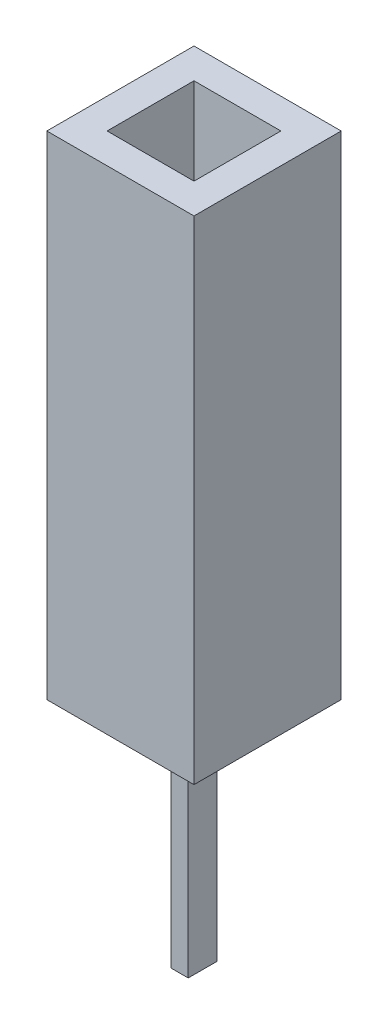
ISO-10303-21;
HEADER;
FILE_DESCRIPTION(('STEP AP214'),'2;1');
FILE_NAME('part.step','',(''),(''),'','','');
FILE_SCHEMA(('AUTOMOTIVE_DESIGN { 1 0 10303 214 1 1 1 1 }'));
ENDSEC;
DATA;
#1=APPLICATION_CONTEXT('core data for automotive mechanical design processes');
#2=APPLICATION_PROTOCOL_DEFINITION('international standard','automotive_design',2000,#1);
#3=PRODUCT_CONTEXT('',#1,'mechanical');
#4=PRODUCT('Part','Part','',(#3));
#5=PRODUCT_RELATED_PRODUCT_CATEGORY('part','',(#4));
#6=PRODUCT_DEFINITION_FORMATION('','',#4);
#7=PRODUCT_DEFINITION_CONTEXT('part definition',#1,'design');
#8=PRODUCT_DEFINITION('design','',#6,#7);
#9=PRODUCT_DEFINITION_SHAPE('','',#8);
#10=(LENGTH_UNIT() NAMED_UNIT(*) SI_UNIT(.MILLI.,.METRE.));
#11=(NAMED_UNIT(*) PLANE_ANGLE_UNIT() SI_UNIT($,.RADIAN.));
#12=(NAMED_UNIT(*) SI_UNIT($,.STERADIAN.) SOLID_ANGLE_UNIT());
#13=UNCERTAINTY_MEASURE_WITH_UNIT(LENGTH_MEASURE(1.E-05),#10,'distance_accuracy_value','');
#14=(GEOMETRIC_REPRESENTATION_CONTEXT(3) GLOBAL_UNCERTAINTY_ASSIGNED_CONTEXT((#13)) GLOBAL_UNIT_ASSIGNED_CONTEXT((#10,
#11,#12)) REPRESENTATION_CONTEXT('',''));
#15=CARTESIAN_POINT('',(0.,0.,0.));
#16=DIRECTION('',(0.,0.,1.));
#17=DIRECTION('',(1.,0.,0.));
#18=AXIS2_PLACEMENT_3D('',#15,#16,#17);
#19=CARTESIAN_POINT('',(-1.27,0.,1.27));
#20=DIRECTION('',(0.,1.,0.));
#21=DIRECTION('',(0.,0.,1.));
#22=AXIS2_PLACEMENT_3D('',#19,#20,#21);
#23=PLANE('',#22);
#24=DIRECTION('',(0.,0.,1.));
#25=VECTOR('',#24,1.);
#26=CARTESIAN_POINT('',(-1.27,0.,-1.27));
#27=LINE('',#26,#25);
#28=CARTESIAN_POINT('',(-1.27,0.,-1.27));
#29=VERTEX_POINT('',#28);
#30=CARTESIAN_POINT('',(-1.27,0.,1.27));
#31=VERTEX_POINT('',#30);
#32=EDGE_CURVE('E194',#29,#31,#27,.T.);
#33=ORIENTED_EDGE('',*,*,#32,.F.);
#34=DIRECTION('',(-1.,0.,0.));
#35=VECTOR('',#34,1.);
#36=CARTESIAN_POINT('',(-1.27,0.,-1.27));
#37=LINE('',#36,#35);
#38=CARTESIAN_POINT('',(1.27,0.,-1.27));
#39=VERTEX_POINT('',#38);
#40=EDGE_CURVE('E201',#39,#29,#37,.T.);
#41=ORIENTED_EDGE('',*,*,#40,.F.);
#42=DIRECTION('',(0.,0.,-1.));
#43=VECTOR('',#42,1.);
#44=CARTESIAN_POINT('',(1.27,0.,-1.27));
#45=LINE('',#44,#43);
#46=CARTESIAN_POINT('',(1.27,0.,1.27));
#47=VERTEX_POINT('',#46);
#48=EDGE_CURVE('E199',#47,#39,#45,.T.);
#49=ORIENTED_EDGE('',*,*,#48,.F.);
#50=DIRECTION('',(1.,0.,0.));
#51=VECTOR('',#50,1.);
#52=CARTESIAN_POINT('',(-1.27,0.,1.27));
#53=LINE('',#52,#51);
#54=EDGE_CURVE('E197',#31,#47,#53,.T.);
#55=ORIENTED_EDGE('',*,*,#54,.F.);
#56=EDGE_LOOP('',(#33,#41,#49,#55));
#57=FACE_BOUND('',#56,.T.);
#58=DIRECTION('',(0.,0.,1.));
#59=VECTOR('',#58,1.);
#60=CARTESIAN_POINT('',(0.15,0.,0.25));
#61=LINE('',#60,#59);
#62=CARTESIAN_POINT('',(0.15,0.,-0.25));
#63=VERTEX_POINT('',#62);
#64=CARTESIAN_POINT('',(0.15,0.,0.25));
#65=VERTEX_POINT('',#64);
#66=EDGE_CURVE('E162',#63,#65,#61,.T.);
#67=ORIENTED_EDGE('',*,*,#66,.F.);
#68=DIRECTION('',(1.,0.,0.));
#69=VECTOR('',#68,1.);
#70=CARTESIAN_POINT('',(0.15,0.,-0.25));
#71=LINE('',#70,#69);
#72=CARTESIAN_POINT('',(-0.15,0.,-0.25));
#73=VERTEX_POINT('',#72);
#74=EDGE_CURVE('E171',#73,#63,#71,.T.);
#75=ORIENTED_EDGE('',*,*,#74,.F.);
#76=DIRECTION('',(0.,0.,-1.));
#77=VECTOR('',#76,1.);
#78=CARTESIAN_POINT('',(-0.15,0.,0.25));
#79=LINE('',#78,#77);
#80=CARTESIAN_POINT('',(-0.15,0.,0.25));
#81=VERTEX_POINT('',#80);
#82=EDGE_CURVE('E168',#81,#73,#79,.T.);
#83=ORIENTED_EDGE('',*,*,#82,.F.);
#84=DIRECTION('',(-1.,0.,0.));
#85=VECTOR('',#84,1.);
#86=CARTESIAN_POINT('',(0.15,0.,0.25));
#87=LINE('',#86,#85);
#88=EDGE_CURVE('E58',#65,#81,#87,.T.);
#89=ORIENTED_EDGE('',*,*,#88,.F.);
#90=EDGE_LOOP('',(#67,#75,#83,#89));
#91=FACE_BOUND('',#90,.T.);
#92=ADVANCED_FACE('F35',(#57,#91),#23,.F.);
#93=CARTESIAN_POINT('',(-1.27,8.5,-1.27));
#94=DIRECTION('',(1.,0.,0.));
#95=DIRECTION('',(0.,0.,-1.));
#96=AXIS2_PLACEMENT_3D('',#93,#94,#95);
#97=PLANE('',#96);
#98=ORIENTED_EDGE('',*,*,#32,.T.);
#99=DIRECTION('',(0.,-1.,0.));
#100=VECTOR('',#99,1.);
#101=CARTESIAN_POINT('',(-1.27,8.5,1.27));
#102=LINE('',#101,#100);
#103=CARTESIAN_POINT('',(-1.27,8.5,1.27));
#104=VERTEX_POINT('',#103);
#105=EDGE_CURVE('E11',#104,#31,#102,.T.);
#106=ORIENTED_EDGE('',*,*,#105,.F.);
#107=DIRECTION('',(0.,0.,1.));
#108=VECTOR('',#107,1.);
#109=CARTESIAN_POINT('',(-1.27,8.5,-1.27));
#110=LINE('',#109,#108);
#111=CARTESIAN_POINT('',(-1.27,8.5,-1.27));
#112=VERTEX_POINT('',#111);
#113=EDGE_CURVE('E203',#112,#104,#110,.T.);
#114=ORIENTED_EDGE('',*,*,#113,.F.);
#115=DIRECTION('',(0.,-1.,0.));
#116=VECTOR('',#115,1.);
#117=CARTESIAN_POINT('',(-1.27,8.5,-1.27));
#118=LINE('',#117,#116);
#119=EDGE_CURVE('E212',#112,#29,#118,.T.);
#120=ORIENTED_EDGE('',*,*,#119,.T.);
#121=EDGE_LOOP('',(#98,#106,#114,#120));
#122=FACE_BOUND('',#121,.T.);
#123=ADVANCED_FACE('F37',(#122),#97,.F.);
#124=CARTESIAN_POINT('',(-1.27,8.5,1.27));
#125=DIRECTION('',(0.,0.,-1.));
#126=DIRECTION('',(-1.,0.,0.));
#127=AXIS2_PLACEMENT_3D('',#124,#125,#126);
#128=PLANE('',#127);
#129=ORIENTED_EDGE('',*,*,#54,.T.);
#130=DIRECTION('',(0.,-1.,0.));
#131=VECTOR('',#130,1.);
#132=CARTESIAN_POINT('',(1.27,8.5,1.27));
#133=LINE('',#132,#131);
#134=CARTESIAN_POINT('',(1.27,8.5,1.27));
#135=VERTEX_POINT('',#134);
#136=EDGE_CURVE('E43',#135,#47,#133,.T.);
#137=ORIENTED_EDGE('',*,*,#136,.F.);
#138=DIRECTION('',(1.,0.,0.));
#139=VECTOR('',#138,1.);
#140=CARTESIAN_POINT('',(-1.27,8.5,1.27));
#141=LINE('',#140,#139);
#142=EDGE_CURVE('E206',#104,#135,#141,.T.);
#143=ORIENTED_EDGE('',*,*,#142,.F.);
#144=ORIENTED_EDGE('',*,*,#105,.T.);
#145=EDGE_LOOP('',(#129,#137,#143,#144));
#146=FACE_BOUND('',#145,.T.);
#147=ADVANCED_FACE('F235',(#146),#128,.F.);
#148=CARTESIAN_POINT('',(1.27,8.5,-1.27));
#149=DIRECTION('',(-1.,0.,0.));
#150=DIRECTION('',(0.,0.,1.));
#151=AXIS2_PLACEMENT_3D('',#148,#149,#150);
#152=PLANE('',#151);
#153=ORIENTED_EDGE('',*,*,#48,.T.);
#154=DIRECTION('',(0.,-1.,0.));
#155=VECTOR('',#154,1.);
#156=CARTESIAN_POINT('',(1.27,8.5,-1.27));
#157=LINE('',#156,#155);
#158=CARTESIAN_POINT('',(1.27,8.5,-1.27));
#159=VERTEX_POINT('',#158);
#160=EDGE_CURVE('E215',#159,#39,#157,.T.);
#161=ORIENTED_EDGE('',*,*,#160,.F.);
#162=DIRECTION('',(0.,0.,-1.));
#163=VECTOR('',#162,1.);
#164=CARTESIAN_POINT('',(1.27,8.5,-1.27));
#165=LINE('',#164,#163);
#166=EDGE_CURVE('E208',#135,#159,#165,.T.);
#167=ORIENTED_EDGE('',*,*,#166,.F.);
#168=ORIENTED_EDGE('',*,*,#136,.T.);
#169=EDGE_LOOP('',(#153,#161,#167,#168));
#170=FACE_BOUND('',#169,.T.);
#171=ADVANCED_FACE('F222',(#170),#152,.F.);
#172=CARTESIAN_POINT('',(-1.27,8.5,-1.27));
#173=DIRECTION('',(0.,0.,1.));
#174=DIRECTION('',(1.,0.,0.));
#175=AXIS2_PLACEMENT_3D('',#172,#173,#174);
#176=PLANE('',#175);
#177=ORIENTED_EDGE('',*,*,#40,.T.);
#178=ORIENTED_EDGE('',*,*,#119,.F.);
#179=DIRECTION('',(-1.,0.,0.));
#180=VECTOR('',#179,1.);
#181=CARTESIAN_POINT('',(-1.27,8.5,-1.27));
#182=LINE('',#181,#180);
#183=EDGE_CURVE('E210',#159,#112,#182,.T.);
#184=ORIENTED_EDGE('',*,*,#183,.F.);
#185=ORIENTED_EDGE('',*,*,#160,.T.);
#186=EDGE_LOOP('',(#177,#178,#184,#185));
#187=FACE_BOUND('',#186,.T.);
#188=ADVANCED_FACE('F230',(#187),#176,.F.);
#189=CARTESIAN_POINT('',(-1.27,8.5,1.27));
#190=DIRECTION('',(0.,1.,0.));
#191=DIRECTION('',(0.,0.,1.));
#192=AXIS2_PLACEMENT_3D('',#189,#190,#191);
#193=PLANE('',#192);
#194=DIRECTION('',(0.,0.,-1.));
#195=VECTOR('',#194,1.);
#196=CARTESIAN_POINT('',(0.75,8.5,-0.75));
#197=LINE('',#196,#195);
#198=CARTESIAN_POINT('',(0.75,8.5,0.75));
#199=VERTEX_POINT('',#198);
#200=CARTESIAN_POINT('',(0.75,8.5,-0.75));
#201=VERTEX_POINT('',#200);
#202=EDGE_CURVE('E50',#199,#201,#197,.T.);
#203=ORIENTED_EDGE('',*,*,#202,.F.);
#204=DIRECTION('',(1.,0.,0.));
#205=VECTOR('',#204,1.);
#206=CARTESIAN_POINT('',(0.75,8.5,0.75));
#207=LINE('',#206,#205);
#208=CARTESIAN_POINT('',(-0.75,8.5,0.75));
#209=VERTEX_POINT('',#208);
#210=EDGE_CURVE('E146',#209,#199,#207,.T.);
#211=ORIENTED_EDGE('',*,*,#210,.F.);
#212=DIRECTION('',(0.,0.,1.));
#213=VECTOR('',#212,1.);
#214=CARTESIAN_POINT('',(-0.75,8.5,-0.75));
#215=LINE('',#214,#213);
#216=CARTESIAN_POINT('',(-0.75,8.5,-0.75));
#217=VERTEX_POINT('',#216);
#218=EDGE_CURVE('E128',#217,#209,#215,.T.);
#219=ORIENTED_EDGE('',*,*,#218,.F.);
#220=DIRECTION('',(-1.,0.,0.));
#221=VECTOR('',#220,1.);
#222=CARTESIAN_POINT('',(0.75,8.5,-0.75));
#223=LINE('',#222,#221);
#224=EDGE_CURVE('E139',#201,#217,#223,.T.);
#225=ORIENTED_EDGE('',*,*,#224,.F.);
#226=EDGE_LOOP('',(#203,#211,#219,#225));
#227=FACE_BOUND('',#226,.T.);
#228=ORIENTED_EDGE('',*,*,#113,.T.);
#229=ORIENTED_EDGE('',*,*,#142,.T.);
#230=ORIENTED_EDGE('',*,*,#166,.T.);
#231=ORIENTED_EDGE('',*,*,#183,.T.);
#232=EDGE_LOOP('',(#228,#229,#230,#231));
#233=FACE_BOUND('',#232,.T.);
#234=ADVANCED_FACE('F143',(#227,#233),#193,.T.);
#235=CARTESIAN_POINT('',(0.15,-3.96,0.25));
#236=DIRECTION('',(-1.,0.,0.));
#237=DIRECTION('',(0.,0.,1.));
#238=AXIS2_PLACEMENT_3D('',#235,#236,#237);
#239=PLANE('',#238);
#240=ORIENTED_EDGE('',*,*,#66,.T.);
#241=DIRECTION('',(0.,1.,0.));
#242=VECTOR('',#241,1.);
#243=CARTESIAN_POINT('',(0.15,-3.96,0.25));
#244=LINE('',#243,#242);
#245=CARTESIAN_POINT('',(0.15,-3.96,0.25));
#246=VERTEX_POINT('',#245);
#247=EDGE_CURVE('E192',#246,#65,#244,.T.);
#248=ORIENTED_EDGE('',*,*,#247,.F.);
#249=DIRECTION('',(0.,0.,1.));
#250=VECTOR('',#249,1.);
#251=CARTESIAN_POINT('',(0.15,-3.96,0.25));
#252=LINE('',#251,#250);
#253=CARTESIAN_POINT('',(0.15,-3.96,-0.25));
#254=VERTEX_POINT('',#253);
#255=EDGE_CURVE('E174',#254,#246,#252,.T.);
#256=ORIENTED_EDGE('',*,*,#255,.F.);
#257=DIRECTION('',(0.,1.,0.));
#258=VECTOR('',#257,1.);
#259=CARTESIAN_POINT('',(0.15,-3.96,-0.25));
#260=LINE('',#259,#258);
#261=EDGE_CURVE('E183',#254,#63,#260,.T.);
#262=ORIENTED_EDGE('',*,*,#261,.T.);
#263=EDGE_LOOP('',(#240,#248,#256,#262));
#264=FACE_BOUND('',#263,.T.);
#265=ADVANCED_FACE('F248',(#264),#239,.F.);
#266=CARTESIAN_POINT('',(0.15,-3.96,0.25));
#267=DIRECTION('',(0.,0.,-1.));
#268=DIRECTION('',(-1.,0.,0.));
#269=AXIS2_PLACEMENT_3D('',#266,#267,#268);
#270=PLANE('',#269);
#271=ORIENTED_EDGE('',*,*,#88,.T.);
#272=DIRECTION('',(0.,1.,0.));
#273=VECTOR('',#272,1.);
#274=CARTESIAN_POINT('',(-0.15,-3.96,0.25));
#275=LINE('',#274,#273);
#276=CARTESIAN_POINT('',(-0.15,-3.96,0.25));
#277=VERTEX_POINT('',#276);
#278=EDGE_CURVE('E189',#277,#81,#275,.T.);
#279=ORIENTED_EDGE('',*,*,#278,.F.);
#280=DIRECTION('',(-1.,0.,0.));
#281=VECTOR('',#280,1.);
#282=CARTESIAN_POINT('',(0.15,-3.96,0.25));
#283=LINE('',#282,#281);
#284=EDGE_CURVE('E177',#246,#277,#283,.T.);
#285=ORIENTED_EDGE('',*,*,#284,.F.);
#286=ORIENTED_EDGE('',*,*,#247,.T.);
#287=EDGE_LOOP('',(#271,#279,#285,#286));
#288=FACE_BOUND('',#287,.T.);
#289=ADVANCED_FACE('F269',(#288),#270,.F.);
#290=CARTESIAN_POINT('',(-0.15,-3.96,0.25));
#291=DIRECTION('',(1.,0.,0.));
#292=DIRECTION('',(0.,0.,-1.));
#293=AXIS2_PLACEMENT_3D('',#290,#291,#292);
#294=PLANE('',#293);
#295=ORIENTED_EDGE('',*,*,#82,.T.);
#296=DIRECTION('',(0.,1.,0.));
#297=VECTOR('',#296,1.);
#298=CARTESIAN_POINT('',(-0.15,-3.96,-0.25));
#299=LINE('',#298,#297);
#300=CARTESIAN_POINT('',(-0.15,-3.96,-0.25));
#301=VERTEX_POINT('',#300);
#302=EDGE_CURVE('E186',#301,#73,#299,.T.);
#303=ORIENTED_EDGE('',*,*,#302,.F.);
#304=DIRECTION('',(0.,0.,-1.));
#305=VECTOR('',#304,1.);
#306=CARTESIAN_POINT('',(-0.15,-3.96,0.25));
#307=LINE('',#306,#305);
#308=EDGE_CURVE('E179',#277,#301,#307,.T.);
#309=ORIENTED_EDGE('',*,*,#308,.F.);
#310=ORIENTED_EDGE('',*,*,#278,.T.);
#311=EDGE_LOOP('',(#295,#303,#309,#310));
#312=FACE_BOUND('',#311,.T.);
#313=ADVANCED_FACE('F276',(#312),#294,.F.);
#314=CARTESIAN_POINT('',(0.15,-3.96,-0.25));
#315=DIRECTION('',(0.,0.,1.));
#316=DIRECTION('',(1.,0.,0.));
#317=AXIS2_PLACEMENT_3D('',#314,#315,#316);
#318=PLANE('',#317);
#319=ORIENTED_EDGE('',*,*,#74,.T.);
#320=ORIENTED_EDGE('',*,*,#261,.F.);
#321=DIRECTION('',(1.,0.,0.));
#322=VECTOR('',#321,1.);
#323=CARTESIAN_POINT('',(0.15,-3.96,-0.25));
#324=LINE('',#323,#322);
#325=EDGE_CURVE('E181',#301,#254,#324,.T.);
#326=ORIENTED_EDGE('',*,*,#325,.F.);
#327=ORIENTED_EDGE('',*,*,#302,.T.);
#328=EDGE_LOOP('',(#319,#320,#326,#327));
#329=FACE_BOUND('',#328,.T.);
#330=ADVANCED_FACE('F283',(#329),#318,.F.);
#331=CARTESIAN_POINT('',(0.15,-3.96,-0.25));
#332=DIRECTION('',(0.,1.,0.));
#333=DIRECTION('',(0.,0.,1.));
#334=AXIS2_PLACEMENT_3D('',#331,#332,#333);
#335=PLANE('',#334);
#336=ORIENTED_EDGE('',*,*,#255,.T.);
#337=ORIENTED_EDGE('',*,*,#284,.T.);
#338=ORIENTED_EDGE('',*,*,#308,.T.);
#339=ORIENTED_EDGE('',*,*,#325,.T.);
#340=EDGE_LOOP('',(#336,#337,#338,#339));
#341=FACE_BOUND('',#340,.T.);
#342=ADVANCED_FACE('F291',(#341),#335,.F.);
#343=CARTESIAN_POINT('',(0.75,1.5,-0.75));
#344=DIRECTION('',(1.,0.,0.));
#345=DIRECTION('',(0.,0.,-1.));
#346=AXIS2_PLACEMENT_3D('',#343,#344,#345);
#347=PLANE('',#346);
#348=ORIENTED_EDGE('',*,*,#202,.T.);
#349=DIRECTION('',(0.,1.,0.));
#350=VECTOR('',#349,1.);
#351=CARTESIAN_POINT('',(0.75,1.5,-0.75));
#352=LINE('',#351,#350);
#353=CARTESIAN_POINT('',(0.75,1.5,-0.75));
#354=VERTEX_POINT('',#353);
#355=EDGE_CURVE('E136',#354,#201,#352,.T.);
#356=ORIENTED_EDGE('',*,*,#355,.F.);
#357=DIRECTION('',(0.,0.,-1.));
#358=VECTOR('',#357,1.);
#359=CARTESIAN_POINT('',(0.75,1.5,-0.75));
#360=LINE('',#359,#358);
#361=CARTESIAN_POINT('',(0.75,1.5,0.75));
#362=VERTEX_POINT('',#361);
#363=EDGE_CURVE('E148',#362,#354,#360,.T.);
#364=ORIENTED_EDGE('',*,*,#363,.F.);
#365=DIRECTION('',(0.,1.,0.));
#366=VECTOR('',#365,1.);
#367=CARTESIAN_POINT('',(0.75,1.5,0.75));
#368=LINE('',#367,#366);
#369=EDGE_CURVE('E160',#362,#199,#368,.T.);
#370=ORIENTED_EDGE('',*,*,#369,.T.);
#371=EDGE_LOOP('',(#348,#356,#364,#370));
#372=FACE_BOUND('',#371,.T.);
#373=ADVANCED_FACE('F298',(#372),#347,.F.);
#374=CARTESIAN_POINT('',(0.75,1.5,0.75));
#375=DIRECTION('',(0.,0.,1.));
#376=DIRECTION('',(1.,0.,0.));
#377=AXIS2_PLACEMENT_3D('',#374,#375,#376);
#378=PLANE('',#377);
#379=ORIENTED_EDGE('',*,*,#210,.T.);
#380=ORIENTED_EDGE('',*,*,#369,.F.);
#381=DIRECTION('',(1.,0.,0.));
#382=VECTOR('',#381,1.);
#383=CARTESIAN_POINT('',(0.75,1.5,0.75));
#384=LINE('',#383,#382);
#385=CARTESIAN_POINT('',(-0.75,1.5,0.75));
#386=VERTEX_POINT('',#385);
#387=EDGE_CURVE('E157',#386,#362,#384,.T.);
#388=ORIENTED_EDGE('',*,*,#387,.F.);
#389=DIRECTION('',(0.,1.,0.));
#390=VECTOR('',#389,1.);
#391=CARTESIAN_POINT('',(-0.75,1.5,0.75));
#392=LINE('',#391,#390);
#393=EDGE_CURVE('E135',#386,#209,#392,.T.);
#394=ORIENTED_EDGE('',*,*,#393,.T.);
#395=EDGE_LOOP('',(#379,#380,#388,#394));
#396=FACE_BOUND('',#395,.T.);
#397=ADVANCED_FACE('F305',(#396),#378,.F.);
#398=CARTESIAN_POINT('',(-0.75,1.5,-0.75));
#399=DIRECTION('',(-1.,0.,0.));
#400=DIRECTION('',(0.,0.,1.));
#401=AXIS2_PLACEMENT_3D('',#398,#399,#400);
#402=PLANE('',#401);
#403=ORIENTED_EDGE('',*,*,#218,.T.);
#404=ORIENTED_EDGE('',*,*,#393,.F.);
#405=DIRECTION('',(0.,0.,1.));
#406=VECTOR('',#405,1.);
#407=CARTESIAN_POINT('',(-0.75,1.5,-0.75));
#408=LINE('',#407,#406);
#409=CARTESIAN_POINT('',(-0.75,1.5,-0.75));
#410=VERTEX_POINT('',#409);
#411=EDGE_CURVE('E131',#410,#386,#408,.T.);
#412=ORIENTED_EDGE('',*,*,#411,.F.);
#413=DIRECTION('',(0.,1.,0.));
#414=VECTOR('',#413,1.);
#415=CARTESIAN_POINT('',(-0.75,1.5,-0.75));
#416=LINE('',#415,#414);
#417=EDGE_CURVE('E124',#410,#217,#416,.T.);
#418=ORIENTED_EDGE('',*,*,#417,.T.);
#419=EDGE_LOOP('',(#403,#404,#412,#418));
#420=FACE_BOUND('',#419,.T.);
#421=ADVANCED_FACE('F126',(#420),#402,.F.);
#422=CARTESIAN_POINT('',(0.75,1.5,-0.75));
#423=DIRECTION('',(0.,0.,-1.));
#424=DIRECTION('',(-1.,0.,0.));
#425=AXIS2_PLACEMENT_3D('',#422,#423,#424);
#426=PLANE('',#425);
#427=ORIENTED_EDGE('',*,*,#224,.T.);
#428=ORIENTED_EDGE('',*,*,#417,.F.);
#429=DIRECTION('',(-1.,0.,0.));
#430=VECTOR('',#429,1.);
#431=CARTESIAN_POINT('',(0.75,1.5,-0.75));
#432=LINE('',#431,#430);
#433=EDGE_CURVE('E154',#354,#410,#432,.T.);
#434=ORIENTED_EDGE('',*,*,#433,.F.);
#435=ORIENTED_EDGE('',*,*,#355,.T.);
#436=EDGE_LOOP('',(#427,#428,#434,#435));
#437=FACE_BOUND('',#436,.T.);
#438=ADVANCED_FACE('F140',(#437),#426,.F.);
#439=CARTESIAN_POINT('',(0.75,1.5,-0.75));
#440=DIRECTION('',(0.,-1.,0.));
#441=DIRECTION('',(0.,0.,-1.));
#442=AXIS2_PLACEMENT_3D('',#439,#440,#441);
#443=PLANE('',#442);
#444=ORIENTED_EDGE('',*,*,#363,.T.);
#445=ORIENTED_EDGE('',*,*,#433,.T.);
#446=ORIENTED_EDGE('',*,*,#411,.T.);
#447=ORIENTED_EDGE('',*,*,#387,.T.);
#448=EDGE_LOOP('',(#444,#445,#446,#447));
#449=FACE_BOUND('',#448,.T.);
#450=ADVANCED_FACE('F325',(#449),#443,.F.);
#451=CLOSED_SHELL('',(#92,#123,#147,#171,#188,#234,#265,#289,#313,#330,#342,#373,#397,#421,#438,#450));
#452=MANIFOLD_SOLID_BREP('B2',#451);
#453=ADVANCED_BREP_SHAPE_REPRESENTATION('',(#18,#452),#14);
#454=SHAPE_DEFINITION_REPRESENTATION(#9,#453);
ENDSEC;
END-ISO-10303-21;
